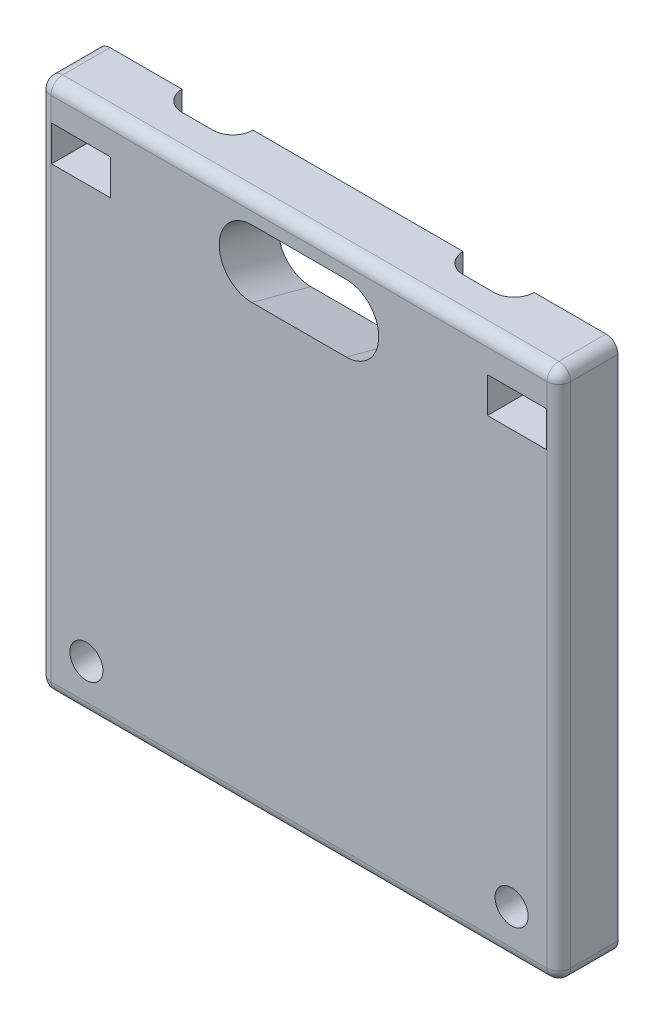
ISO-10303-21;
HEADER;
FILE_DESCRIPTION(('STEP AP214'),'2;1');
FILE_NAME('part.step','',(''),(''),'','','');
FILE_SCHEMA(('AUTOMOTIVE_DESIGN { 1 0 10303 214 1 1 1 1 }'));
ENDSEC;
DATA;
#1=APPLICATION_CONTEXT('core data for automotive mechanical design processes');
#2=APPLICATION_PROTOCOL_DEFINITION('international standard','automotive_design',2000,#1);
#3=PRODUCT_CONTEXT('',#1,'mechanical');
#4=PRODUCT('Part','Part','',(#3));
#5=PRODUCT_RELATED_PRODUCT_CATEGORY('part','',(#4));
#6=PRODUCT_DEFINITION_FORMATION('','',#4);
#7=PRODUCT_DEFINITION_CONTEXT('part definition',#1,'design');
#8=PRODUCT_DEFINITION('design','',#6,#7);
#9=PRODUCT_DEFINITION_SHAPE('','',#8);
#10=(LENGTH_UNIT() NAMED_UNIT(*) SI_UNIT(.MILLI.,.METRE.));
#11=(NAMED_UNIT(*) PLANE_ANGLE_UNIT() SI_UNIT($,.RADIAN.));
#12=(NAMED_UNIT(*) SI_UNIT($,.STERADIAN.) SOLID_ANGLE_UNIT());
#13=UNCERTAINTY_MEASURE_WITH_UNIT(LENGTH_MEASURE(1.E-05),#10,'distance_accuracy_value','');
#14=(GEOMETRIC_REPRESENTATION_CONTEXT(3) GLOBAL_UNCERTAINTY_ASSIGNED_CONTEXT((#13)) GLOBAL_UNIT_ASSIGNED_CONTEXT((#10,
#11,#12)) REPRESENTATION_CONTEXT('',''));
#15=CARTESIAN_POINT('',(0.,0.,0.));
#16=DIRECTION('',(0.,0.,1.));
#17=DIRECTION('',(1.,0.,0.));
#18=AXIS2_PLACEMENT_3D('',#15,#16,#17);
#19=CARTESIAN_POINT('',(0.,0.,0.));
#20=DIRECTION('',(0.,0.,1.));
#21=DIRECTION('',(1.,0.,0.));
#22=AXIS2_PLACEMENT_3D('',#19,#20,#21);
#23=PLANE('',#22);
#24=CARTESIAN_POINT('',(-18.,-18.5,0.));
#25=DIRECTION('',(0.,0.,-1.));
#26=DIRECTION('',(1.,0.,0.));
#27=AXIS2_PLACEMENT_3D('',#24,#25,#26);
#28=CIRCLE('',#27,1.4);
#29=CARTESIAN_POINT('',(-16.6,-18.5,0.));
#30=VERTEX_POINT('',#29);
#31=EDGE_CURVE('E484',#30,#30,#28,.T.);
#32=ORIENTED_EDGE('',*,*,#31,.F.);
#33=EDGE_LOOP('',(#32));
#34=FACE_BOUND('',#33,.T.);
#35=DIRECTION('',(1.,0.,0.));
#36=VECTOR('',#35,1.);
#37=CARTESIAN_POINT('',(-20.95,19.5,0.));
#38=LINE('',#37,#36);
#39=CARTESIAN_POINT('',(-20.95,19.5,0.));
#40=VERTEX_POINT('',#39);
#41=CARTESIAN_POINT('',(-15.95,19.5,0.));
#42=VERTEX_POINT('',#41);
#43=EDGE_CURVE('E300',#40,#42,#38,.T.);
#44=ORIENTED_EDGE('',*,*,#43,.F.);
#45=DIRECTION('',(0.,1.,0.));
#46=VECTOR('',#45,1.);
#47=CARTESIAN_POINT('',(-20.95,19.5,0.));
#48=LINE('',#47,#46);
#49=CARTESIAN_POINT('',(-20.95,16.5,0.));
#50=VERTEX_POINT('',#49);
#51=EDGE_CURVE('E272',#50,#40,#48,.T.);
#52=ORIENTED_EDGE('',*,*,#51,.F.);
#53=DIRECTION('',(-1.,0.,0.));
#54=VECTOR('',#53,1.);
#55=CARTESIAN_POINT('',(-20.95,16.5,0.));
#56=LINE('',#55,#54);
#57=CARTESIAN_POINT('',(-15.95,16.5,0.));
#58=VERTEX_POINT('',#57);
#59=EDGE_CURVE('E293',#58,#50,#56,.T.);
#60=ORIENTED_EDGE('',*,*,#59,.F.);
#61=DIRECTION('',(0.,-1.,0.));
#62=VECTOR('',#61,1.);
#63=CARTESIAN_POINT('',(-15.95,19.5,0.));
#64=LINE('',#63,#62);
#65=EDGE_CURVE('E296',#42,#58,#64,.T.);
#66=ORIENTED_EDGE('',*,*,#65,.F.);
#67=EDGE_LOOP('',(#44,#52,#60,#66));
#68=FACE_BOUND('',#67,.T.);
#69=DIRECTION('',(1.,0.,0.));
#70=VECTOR('',#69,1.);
#71=CARTESIAN_POINT('',(-22.,-22.5,0.));
#72=LINE('',#71,#70);
#73=CARTESIAN_POINT('',(-21.,-22.5,0.));
#74=VERTEX_POINT('',#73);
#75=CARTESIAN_POINT('',(-14.9,-22.5,0.));
#76=VERTEX_POINT('',#75);
#77=EDGE_CURVE('E397',#74,#76,#72,.T.);
#78=ORIENTED_EDGE('',*,*,#77,.F.);
#79=CARTESIAN_POINT('',(-21.,-21.5,0.));
#80=DIRECTION('',(0.,0.,1.));
#81=DIRECTION('',(1.,0.,0.));
#82=AXIS2_PLACEMENT_3D('',#79,#80,#81);
#83=CIRCLE('',#82,1.);
#84=CARTESIAN_POINT('',(-22.,-21.5,0.));
#85=VERTEX_POINT('',#84);
#86=EDGE_CURVE('E11',#74,#85,#83,.F.);
#87=ORIENTED_EDGE('',*,*,#86,.T.);
#88=DIRECTION('',(0.,-1.,0.));
#89=VECTOR('',#88,1.);
#90=CARTESIAN_POINT('',(-22.,22.5,0.));
#91=LINE('',#90,#89);
#92=CARTESIAN_POINT('',(-22.,21.5,0.));
#93=VERTEX_POINT('',#92);
#94=EDGE_CURVE('E392',#93,#85,#91,.T.);
#95=ORIENTED_EDGE('',*,*,#94,.F.);
#96=CARTESIAN_POINT('',(-21.,21.5,0.));
#97=DIRECTION('',(0.,0.,1.));
#98=DIRECTION('',(1.,0.,0.));
#99=AXIS2_PLACEMENT_3D('',#96,#97,#98);
#100=CIRCLE('',#99,1.);
#101=CARTESIAN_POINT('',(-21.,22.5,0.));
#102=VERTEX_POINT('',#101);
#103=EDGE_CURVE('E46',#93,#102,#100,.F.);
#104=ORIENTED_EDGE('',*,*,#103,.T.);
#105=DIRECTION('',(-1.,0.,0.));
#106=VECTOR('',#105,1.);
#107=CARTESIAN_POINT('',(-22.,22.5,0.));
#108=LINE('',#107,#106);
#109=CARTESIAN_POINT('',(-14.9,22.5,0.));
#110=VERTEX_POINT('',#109);
#111=EDGE_CURVE('E389',#110,#102,#108,.T.);
#112=ORIENTED_EDGE('',*,*,#111,.F.);
#113=DIRECTION('',(0.,1.,0.));
#114=VECTOR('',#113,1.);
#115=CARTESIAN_POINT('',(-14.9,-22.5,0.));
#116=LINE('',#115,#114);
#117=EDGE_CURVE('E353',#76,#110,#116,.T.);
#118=ORIENTED_EDGE('',*,*,#117,.F.);
#119=EDGE_LOOP('',(#78,#87,#95,#104,#112,#118));
#120=FACE_BOUND('',#119,.T.);
#121=ADVANCED_FACE('F37',(#34,#68,#120),#23,.F.);
#122=CARTESIAN_POINT('',(18.,-18.5,0.));
#123=DIRECTION('',(0.,0.,-1.));
#124=DIRECTION('',(-1.,0.,0.));
#125=AXIS2_PLACEMENT_3D('',#122,#123,#124);
#126=CIRCLE('',#125,1.4);
#127=CARTESIAN_POINT('',(16.6,-18.5,0.));
#128=VERTEX_POINT('',#127);
#129=EDGE_CURVE('E488',#128,#128,#126,.T.);
#130=ORIENTED_EDGE('',*,*,#129,.F.);
#131=EDGE_LOOP('',(#130));
#132=FACE_BOUND('',#131,.T.);
#133=DIRECTION('',(1.,0.,0.));
#134=VECTOR('',#133,1.);
#135=CARTESIAN_POINT('',(20.95,19.5,0.));
#136=LINE('',#135,#134);
#137=CARTESIAN_POINT('',(15.95,19.5,0.));
#138=VERTEX_POINT('',#137);
#139=CARTESIAN_POINT('',(20.95,19.5,0.));
#140=VERTEX_POINT('',#139);
#141=EDGE_CURVE('E271',#138,#140,#136,.T.);
#142=ORIENTED_EDGE('',*,*,#141,.F.);
#143=DIRECTION('',(0.,1.,0.));
#144=VECTOR('',#143,1.);
#145=CARTESIAN_POINT('',(15.95,19.5,0.));
#146=LINE('',#145,#144);
#147=CARTESIAN_POINT('',(15.95,16.5,0.));
#148=VERTEX_POINT('',#147);
#149=EDGE_CURVE('E241',#148,#138,#146,.T.);
#150=ORIENTED_EDGE('',*,*,#149,.F.);
#151=DIRECTION('',(-1.,0.,0.));
#152=VECTOR('',#151,1.);
#153=CARTESIAN_POINT('',(20.95,16.5,0.));
#154=LINE('',#153,#152);
#155=CARTESIAN_POINT('',(20.95,16.5,0.));
#156=VERTEX_POINT('',#155);
#157=EDGE_CURVE('E259',#156,#148,#154,.T.);
#158=ORIENTED_EDGE('',*,*,#157,.F.);
#159=DIRECTION('',(0.,-1.,0.));
#160=VECTOR('',#159,1.);
#161=CARTESIAN_POINT('',(20.95,19.5,0.));
#162=LINE('',#161,#160);
#163=EDGE_CURVE('E262',#140,#156,#162,.T.);
#164=ORIENTED_EDGE('',*,*,#163,.F.);
#165=EDGE_LOOP('',(#142,#150,#158,#164));
#166=FACE_BOUND('',#165,.T.);
#167=CARTESIAN_POINT('',(21.,22.5,0.));
#168=VERTEX_POINT('',#167);
#169=CARTESIAN_POINT('',(14.9,22.5,0.));
#170=VERTEX_POINT('',#169);
#171=EDGE_CURVE('E390',#168,#170,#108,.T.);
#172=ORIENTED_EDGE('',*,*,#171,.F.);
#173=CARTESIAN_POINT('',(21.,21.5,0.));
#174=DIRECTION('',(0.,0.,1.));
#175=DIRECTION('',(1.,0.,0.));
#176=AXIS2_PLACEMENT_3D('',#173,#174,#175);
#177=CIRCLE('',#176,1.);
#178=CARTESIAN_POINT('',(22.,21.5,0.));
#179=VERTEX_POINT('',#178);
#180=EDGE_CURVE('E446',#168,#179,#177,.F.);
#181=ORIENTED_EDGE('',*,*,#180,.T.);
#182=DIRECTION('',(0.,1.,0.));
#183=VECTOR('',#182,1.);
#184=CARTESIAN_POINT('',(22.,22.5,0.));
#185=LINE('',#184,#183);
#186=CARTESIAN_POINT('',(22.,-21.5,0.));
#187=VERTEX_POINT('',#186);
#188=EDGE_CURVE('E355',#187,#179,#185,.T.);
#189=ORIENTED_EDGE('',*,*,#188,.F.);
#190=CARTESIAN_POINT('',(21.,-21.5,0.));
#191=DIRECTION('',(0.,0.,1.));
#192=DIRECTION('',(1.,0.,0.));
#193=AXIS2_PLACEMENT_3D('',#190,#191,#192);
#194=CIRCLE('',#193,1.);
#195=CARTESIAN_POINT('',(21.,-22.5,0.));
#196=VERTEX_POINT('',#195);
#197=EDGE_CURVE('E444',#187,#196,#194,.F.);
#198=ORIENTED_EDGE('',*,*,#197,.T.);
#199=CARTESIAN_POINT('',(14.9,-22.5,0.));
#200=VERTEX_POINT('',#199);
#201=EDGE_CURVE('E396',#200,#196,#72,.T.);
#202=ORIENTED_EDGE('',*,*,#201,.F.);
#203=DIRECTION('',(0.,1.,0.));
#204=VECTOR('',#203,1.);
#205=CARTESIAN_POINT('',(14.9,-22.5,0.));
#206=LINE('',#205,#204);
#207=EDGE_CURVE('E362',#200,#170,#206,.T.);
#208=ORIENTED_EDGE('',*,*,#207,.T.);
#209=EDGE_LOOP('',(#172,#181,#189,#198,#202,#208));
#210=FACE_BOUND('',#209,.T.);
#211=ADVANCED_FACE('F505',(#132,#166,#210),#23,.F.);
#212=CARTESIAN_POINT('',(22.,22.5,5.));
#213=DIRECTION('',(-1.,0.,0.));
#214=DIRECTION('',(0.,-1.,0.));
#215=AXIS2_PLACEMENT_3D('',#212,#213,#214);
#216=PLANE('',#215);
#217=ORIENTED_EDGE('',*,*,#188,.T.);
#218=DIRECTION('',(0.,0.,-1.));
#219=VECTOR('',#218,1.);
#220=CARTESIAN_POINT('',(22.,21.5,5.));
#221=LINE('',#220,#219);
#222=CARTESIAN_POINT('',(22.,21.5,4.));
#223=VERTEX_POINT('',#222);
#224=EDGE_CURVE('E432',#179,#223,#221,.F.);
#225=ORIENTED_EDGE('',*,*,#224,.T.);
#226=DIRECTION('',(0.,1.,0.));
#227=VECTOR('',#226,1.);
#228=CARTESIAN_POINT('',(22.,-22.5,4.));
#229=LINE('',#228,#227);
#230=CARTESIAN_POINT('',(22.,-21.5,4.));
#231=VERTEX_POINT('',#230);
#232=EDGE_CURVE('E430',#223,#231,#229,.F.);
#233=ORIENTED_EDGE('',*,*,#232,.T.);
#234=DIRECTION('',(0.,0.,-1.));
#235=VECTOR('',#234,1.);
#236=CARTESIAN_POINT('',(22.,-21.5,5.));
#237=LINE('',#236,#235);
#238=EDGE_CURVE('E428',#231,#187,#237,.T.);
#239=ORIENTED_EDGE('',*,*,#238,.T.);
#240=EDGE_LOOP('',(#217,#225,#233,#239));
#241=FACE_BOUND('',#240,.T.);
#242=ADVANCED_FACE('F508',(#241),#216,.F.);
#243=CARTESIAN_POINT('',(-22.,22.5,5.));
#244=DIRECTION('',(0.,-1.,0.));
#245=DIRECTION('',(0.,0.,-1.));
#246=AXIS2_PLACEMENT_3D('',#243,#244,#245);
#247=PLANE('',#246);
#248=DIRECTION('',(-1.,0.,0.));
#249=VECTOR('',#248,1.);
#250=CARTESIAN_POINT('',(22.,22.5,4.));
#251=LINE('',#250,#249);
#252=CARTESIAN_POINT('',(-21.,22.5,4.));
#253=VERTEX_POINT('',#252);
#254=CARTESIAN_POINT('',(21.,22.5,4.));
#255=VERTEX_POINT('',#254);
#256=EDGE_CURVE('E54',#253,#255,#251,.F.);
#257=ORIENTED_EDGE('',*,*,#256,.T.);
#258=DIRECTION('',(0.,0.,-1.));
#259=VECTOR('',#258,1.);
#260=CARTESIAN_POINT('',(21.,22.5,5.));
#261=LINE('',#260,#259);
#262=EDGE_CURVE('E442',#255,#168,#261,.T.);
#263=ORIENTED_EDGE('',*,*,#262,.T.);
#264=ORIENTED_EDGE('',*,*,#171,.T.);
#265=CARTESIAN_POINT('',(13.2,22.5,0.));
#266=DIRECTION('',(0.,1.,0.));
#267=DIRECTION('',(0.,0.,-1.));
#268=AXIS2_PLACEMENT_3D('',#265,#266,#267);
#269=CIRCLE('',#268,1.7);
#270=CARTESIAN_POINT('',(13.2,22.5,1.7));
#271=VERTEX_POINT('',#270);
#272=EDGE_CURVE('E349',#271,#170,#269,.T.);
#273=ORIENTED_EDGE('',*,*,#272,.F.);
#274=DIRECTION('',(1.,0.,0.));
#275=VECTOR('',#274,1.);
#276=CARTESIAN_POINT('',(13.2,22.5,1.7));
#277=LINE('',#276,#275);
#278=CARTESIAN_POINT('',(10.6,22.5,1.7));
#279=VERTEX_POINT('',#278);
#280=EDGE_CURVE('E371',#279,#271,#277,.T.);
#281=ORIENTED_EDGE('',*,*,#280,.F.);
#282=CARTESIAN_POINT('',(10.6,22.5,0.));
#283=DIRECTION('',(0.,1.,0.));
#284=DIRECTION('',(0.,0.,-1.));
#285=AXIS2_PLACEMENT_3D('',#282,#283,#284);
#286=CIRCLE('',#285,1.7);
#287=CARTESIAN_POINT('',(8.9,22.5,0.));
#288=VERTEX_POINT('',#287);
#289=EDGE_CURVE('E374',#288,#279,#286,.T.);
#290=ORIENTED_EDGE('',*,*,#289,.F.);
#291=CARTESIAN_POINT('',(-8.9,22.5,0.));
#292=VERTEX_POINT('',#291);
#293=EDGE_CURVE('E393',#288,#292,#108,.T.);
#294=ORIENTED_EDGE('',*,*,#293,.T.);
#295=CARTESIAN_POINT('',(-10.6,22.5,0.));
#296=DIRECTION('',(0.,1.,0.));
#297=DIRECTION('',(0.,0.,1.));
#298=AXIS2_PLACEMENT_3D('',#295,#296,#297);
#299=CIRCLE('',#298,1.7);
#300=CARTESIAN_POINT('',(-10.6,22.5,1.7));
#301=VERTEX_POINT('',#300);
#302=EDGE_CURVE('E338',#301,#292,#299,.T.);
#303=ORIENTED_EDGE('',*,*,#302,.F.);
#304=DIRECTION('',(1.,0.,0.));
#305=VECTOR('',#304,1.);
#306=CARTESIAN_POINT('',(-13.2,22.5,1.7));
#307=LINE('',#306,#305);
#308=CARTESIAN_POINT('',(-13.2,22.5,1.7));
#309=VERTEX_POINT('',#308);
#310=EDGE_CURVE('E348',#309,#301,#307,.T.);
#311=ORIENTED_EDGE('',*,*,#310,.F.);
#312=CARTESIAN_POINT('',(-13.2,22.5,0.));
#313=DIRECTION('',(0.,1.,0.));
#314=DIRECTION('',(0.,0.,1.));
#315=AXIS2_PLACEMENT_3D('',#312,#313,#314);
#316=CIRCLE('',#315,1.7);
#317=EDGE_CURVE('E345',#110,#309,#316,.T.);
#318=ORIENTED_EDGE('',*,*,#317,.F.);
#319=ORIENTED_EDGE('',*,*,#111,.T.);
#320=DIRECTION('',(0.,0.,-1.));
#321=VECTOR('',#320,1.);
#322=CARTESIAN_POINT('',(-21.,22.5,5.));
#323=LINE('',#322,#321);
#324=EDGE_CURVE('E59',#102,#253,#323,.F.);
#325=ORIENTED_EDGE('',*,*,#324,.T.);
#326=EDGE_LOOP('',(#257,#263,#264,#273,#281,#290,#294,#303,#311,#318,#319,#325));
#327=FACE_BOUND('',#326,.T.);
#328=ADVANCED_FACE('F551',(#327),#247,.F.);
#329=CARTESIAN_POINT('',(-22.,22.5,5.));
#330=DIRECTION('',(1.,0.,0.));
#331=DIRECTION('',(0.,1.,0.));
#332=AXIS2_PLACEMENT_3D('',#329,#330,#331);
#333=PLANE('',#332);
#334=ORIENTED_EDGE('',*,*,#94,.T.);
#335=DIRECTION('',(0.,0.,-1.));
#336=VECTOR('',#335,1.);
#337=CARTESIAN_POINT('',(-22.,-21.5,5.));
#338=LINE('',#337,#336);
#339=CARTESIAN_POINT('',(-22.,-21.5,4.));
#340=VERTEX_POINT('',#339);
#341=EDGE_CURVE('E426',#85,#340,#338,.F.);
#342=ORIENTED_EDGE('',*,*,#341,.T.);
#343=DIRECTION('',(0.,-1.,0.));
#344=VECTOR('',#343,1.);
#345=CARTESIAN_POINT('',(-22.,22.5,4.));
#346=LINE('',#345,#344);
#347=CARTESIAN_POINT('',(-22.,21.5,4.));
#348=VERTEX_POINT('',#347);
#349=EDGE_CURVE('E423',#340,#348,#346,.F.);
#350=ORIENTED_EDGE('',*,*,#349,.T.);
#351=DIRECTION('',(0.,0.,-1.));
#352=VECTOR('',#351,1.);
#353=CARTESIAN_POINT('',(-22.,21.5,5.));
#354=LINE('',#353,#352);
#355=EDGE_CURVE('E421',#348,#93,#354,.T.);
#356=ORIENTED_EDGE('',*,*,#355,.T.);
#357=EDGE_LOOP('',(#334,#342,#350,#356));
#358=FACE_BOUND('',#357,.T.);
#359=ADVANCED_FACE('F577',(#358),#333,.F.);
#360=CARTESIAN_POINT('',(-22.,-22.5,5.));
#361=DIRECTION('',(0.,1.,0.));
#362=DIRECTION('',(0.,0.,1.));
#363=AXIS2_PLACEMENT_3D('',#360,#361,#362);
#364=PLANE('',#363);
#365=ORIENTED_EDGE('',*,*,#201,.T.);
#366=DIRECTION('',(0.,0.,-1.));
#367=VECTOR('',#366,1.);
#368=CARTESIAN_POINT('',(21.,-22.5,5.));
#369=LINE('',#368,#367);
#370=CARTESIAN_POINT('',(21.,-22.5,4.));
#371=VERTEX_POINT('',#370);
#372=EDGE_CURVE('E438',#196,#371,#369,.F.);
#373=ORIENTED_EDGE('',*,*,#372,.T.);
#374=DIRECTION('',(1.,0.,0.));
#375=VECTOR('',#374,1.);
#376=CARTESIAN_POINT('',(-22.,-22.5,4.));
#377=LINE('',#376,#375);
#378=CARTESIAN_POINT('',(-21.,-22.5,4.));
#379=VERTEX_POINT('',#378);
#380=EDGE_CURVE('E436',#371,#379,#377,.F.);
#381=ORIENTED_EDGE('',*,*,#380,.T.);
#382=DIRECTION('',(0.,0.,-1.));
#383=VECTOR('',#382,1.);
#384=CARTESIAN_POINT('',(-21.,-22.5,5.));
#385=LINE('',#384,#383);
#386=EDGE_CURVE('E434',#379,#74,#385,.T.);
#387=ORIENTED_EDGE('',*,*,#386,.T.);
#388=ORIENTED_EDGE('',*,*,#77,.T.);
#389=CARTESIAN_POINT('',(-13.2,-22.5,0.));
#390=DIRECTION('',(0.,1.,0.));
#391=DIRECTION('',(0.,0.,1.));
#392=AXIS2_PLACEMENT_3D('',#389,#390,#391);
#393=CIRCLE('',#392,1.7);
#394=CARTESIAN_POINT('',(-13.2,-22.5,1.7));
#395=VERTEX_POINT('',#394);
#396=EDGE_CURVE('E334',#76,#395,#393,.T.);
#397=ORIENTED_EDGE('',*,*,#396,.T.);
#398=DIRECTION('',(1.,0.,0.));
#399=VECTOR('',#398,1.);
#400=CARTESIAN_POINT('',(-13.2,-22.5,1.7));
#401=LINE('',#400,#399);
#402=CARTESIAN_POINT('',(-10.6,-22.5,1.7));
#403=VERTEX_POINT('',#402);
#404=EDGE_CURVE('E337',#395,#403,#401,.T.);
#405=ORIENTED_EDGE('',*,*,#404,.T.);
#406=CARTESIAN_POINT('',(-10.6,-22.5,0.));
#407=DIRECTION('',(0.,1.,0.));
#408=DIRECTION('',(0.,0.,1.));
#409=AXIS2_PLACEMENT_3D('',#406,#407,#408);
#410=CIRCLE('',#409,1.7);
#411=CARTESIAN_POINT('',(-8.9,-22.5,0.));
#412=VERTEX_POINT('',#411);
#413=EDGE_CURVE('E341',#403,#412,#410,.T.);
#414=ORIENTED_EDGE('',*,*,#413,.T.);
#415=CARTESIAN_POINT('',(8.9,-22.5,0.));
#416=VERTEX_POINT('',#415);
#417=EDGE_CURVE('E400',#412,#416,#72,.T.);
#418=ORIENTED_EDGE('',*,*,#417,.T.);
#419=CARTESIAN_POINT('',(10.6,-22.5,0.));
#420=DIRECTION('',(0.,1.,0.));
#421=DIRECTION('',(0.,0.,-1.));
#422=AXIS2_PLACEMENT_3D('',#419,#420,#421);
#423=CIRCLE('',#422,1.7);
#424=CARTESIAN_POINT('',(10.6,-22.5,1.7));
#425=VERTEX_POINT('',#424);
#426=EDGE_CURVE('E382',#416,#425,#423,.T.);
#427=ORIENTED_EDGE('',*,*,#426,.T.);
#428=DIRECTION('',(1.,0.,0.));
#429=VECTOR('',#428,1.);
#430=CARTESIAN_POINT('',(13.2,-22.5,1.7));
#431=LINE('',#430,#429);
#432=CARTESIAN_POINT('',(13.2,-22.5,1.7));
#433=VERTEX_POINT('',#432);
#434=EDGE_CURVE('E365',#425,#433,#431,.T.);
#435=ORIENTED_EDGE('',*,*,#434,.T.);
#436=CARTESIAN_POINT('',(13.2,-22.5,0.));
#437=DIRECTION('',(0.,1.,0.));
#438=DIRECTION('',(0.,0.,-1.));
#439=AXIS2_PLACEMENT_3D('',#436,#437,#438);
#440=CIRCLE('',#439,1.7);
#441=EDGE_CURVE('E375',#433,#200,#440,.T.);
#442=ORIENTED_EDGE('',*,*,#441,.T.);
#443=EDGE_LOOP('',(#365,#373,#381,#387,#388,#397,#405,#414,#418,#427,#435,#442));
#444=FACE_BOUND('',#443,.T.);
#445=ADVANCED_FACE('F538',(#444),#364,.F.);
#446=CARTESIAN_POINT('',(0.,0.,5.));
#447=DIRECTION('',(0.,0.,1.));
#448=DIRECTION('',(1.,0.,0.));
#449=AXIS2_PLACEMENT_3D('',#446,#447,#448);
#450=PLANE('',#449);
#451=DIRECTION('',(0.,-1.,0.));
#452=VECTOR('',#451,1.);
#453=CARTESIAN_POINT('',(-21.,-22.5,5.));
#454=LINE('',#453,#452);
#455=CARTESIAN_POINT('',(-21.,21.5,5.));
#456=VERTEX_POINT('',#455);
#457=CARTESIAN_POINT('',(-21.,-21.5,5.));
#458=VERTEX_POINT('',#457);
#459=EDGE_CURVE('E416',#456,#458,#454,.T.);
#460=ORIENTED_EDGE('',*,*,#459,.T.);
#461=DIRECTION('',(1.,0.,0.));
#462=VECTOR('',#461,1.);
#463=CARTESIAN_POINT('',(22.,-21.5,5.));
#464=LINE('',#463,#462);
#465=CARTESIAN_POINT('',(21.,-21.5,5.));
#466=VERTEX_POINT('',#465);
#467=EDGE_CURVE('E419',#458,#466,#464,.T.);
#468=ORIENTED_EDGE('',*,*,#467,.T.);
#469=DIRECTION('',(0.,1.,0.));
#470=VECTOR('',#469,1.);
#471=CARTESIAN_POINT('',(21.,22.5,5.));
#472=LINE('',#471,#470);
#473=CARTESIAN_POINT('',(21.,21.5,5.));
#474=VERTEX_POINT('',#473);
#475=EDGE_CURVE('E414',#466,#474,#472,.T.);
#476=ORIENTED_EDGE('',*,*,#475,.T.);
#477=DIRECTION('',(-1.,0.,0.));
#478=VECTOR('',#477,1.);
#479=CARTESIAN_POINT('',(-22.,21.5,5.));
#480=LINE('',#479,#478);
#481=EDGE_CURVE('E412',#474,#456,#480,.T.);
#482=ORIENTED_EDGE('',*,*,#481,.T.);
#483=EDGE_LOOP('',(#460,#468,#476,#482));
#484=FACE_BOUND('',#483,.T.);
#485=CARTESIAN_POINT('',(18.,-18.5,5.));
#486=DIRECTION('',(0.,0.,-1.));
#487=DIRECTION('',(-1.,0.,0.));
#488=AXIS2_PLACEMENT_3D('',#485,#486,#487);
#489=CIRCLE('',#488,1.4);
#490=CARTESIAN_POINT('',(16.6,-18.5,5.));
#491=VERTEX_POINT('',#490);
#492=EDGE_CURVE('E292',#491,#491,#489,.T.);
#493=ORIENTED_EDGE('',*,*,#492,.T.);
#494=EDGE_LOOP('',(#493));
#495=FACE_BOUND('',#494,.T.);
#496=CARTESIAN_POINT('',(-18.,-18.5,5.));
#497=DIRECTION('',(0.,0.,-1.));
#498=DIRECTION('',(1.,0.,0.));
#499=AXIS2_PLACEMENT_3D('',#496,#497,#498);
#500=CIRCLE('',#499,1.4);
#501=CARTESIAN_POINT('',(-16.6,-18.5,5.));
#502=VERTEX_POINT('',#501);
#503=EDGE_CURVE('E265',#502,#502,#500,.T.);
#504=ORIENTED_EDGE('',*,*,#503,.T.);
#505=EDGE_LOOP('',(#504));
#506=FACE_BOUND('',#505,.T.);
#507=DIRECTION('',(0.,1.,0.));
#508=VECTOR('',#507,1.);
#509=CARTESIAN_POINT('',(15.95,19.5,5.));
#510=LINE('',#509,#508);
#511=CARTESIAN_POINT('',(15.95,16.5,5.));
#512=VERTEX_POINT('',#511);
#513=CARTESIAN_POINT('',(15.95,19.5,5.));
#514=VERTEX_POINT('',#513);
#515=EDGE_CURVE('E238',#512,#514,#510,.T.);
#516=ORIENTED_EDGE('',*,*,#515,.T.);
#517=DIRECTION('',(1.,0.,0.));
#518=VECTOR('',#517,1.);
#519=CARTESIAN_POINT('',(20.95,19.5,5.));
#520=LINE('',#519,#518);
#521=CARTESIAN_POINT('',(20.95,19.5,5.));
#522=VERTEX_POINT('',#521);
#523=EDGE_CURVE('E250',#514,#522,#520,.T.);
#524=ORIENTED_EDGE('',*,*,#523,.T.);
#525=DIRECTION('',(0.,-1.,0.));
#526=VECTOR('',#525,1.);
#527=CARTESIAN_POINT('',(20.95,19.5,5.));
#528=LINE('',#527,#526);
#529=CARTESIAN_POINT('',(20.95,16.5,5.));
#530=VERTEX_POINT('',#529);
#531=EDGE_CURVE('E254',#522,#530,#528,.T.);
#532=ORIENTED_EDGE('',*,*,#531,.T.);
#533=DIRECTION('',(-1.,0.,0.));
#534=VECTOR('',#533,1.);
#535=CARTESIAN_POINT('',(20.95,16.5,5.));
#536=LINE('',#535,#534);
#537=EDGE_CURVE('E246',#530,#512,#536,.T.);
#538=ORIENTED_EDGE('',*,*,#537,.T.);
#539=EDGE_LOOP('',(#516,#524,#532,#538));
#540=FACE_BOUND('',#539,.T.);
#541=DIRECTION('',(0.,1.,0.));
#542=VECTOR('',#541,1.);
#543=CARTESIAN_POINT('',(-20.95,19.5,5.));
#544=LINE('',#543,#542);
#545=CARTESIAN_POINT('',(-20.95,16.5,5.));
#546=VERTEX_POINT('',#545);
#547=CARTESIAN_POINT('',(-20.95,19.5,5.));
#548=VERTEX_POINT('',#547);
#549=EDGE_CURVE('E297',#546,#548,#544,.T.);
#550=ORIENTED_EDGE('',*,*,#549,.T.);
#551=DIRECTION('',(1.,0.,0.));
#552=VECTOR('',#551,1.);
#553=CARTESIAN_POINT('',(-20.95,19.5,5.));
#554=LINE('',#553,#552);
#555=CARTESIAN_POINT('',(-15.95,19.5,5.));
#556=VERTEX_POINT('',#555);
#557=EDGE_CURVE('E309',#548,#556,#554,.T.);
#558=ORIENTED_EDGE('',*,*,#557,.T.);
#559=DIRECTION('',(0.,-1.,0.));
#560=VECTOR('',#559,1.);
#561=CARTESIAN_POINT('',(-15.95,19.5,5.));
#562=LINE('',#561,#560);
#563=CARTESIAN_POINT('',(-15.95,16.5,5.));
#564=VERTEX_POINT('',#563);
#565=EDGE_CURVE('E306',#556,#564,#562,.T.);
#566=ORIENTED_EDGE('',*,*,#565,.T.);
#567=DIRECTION('',(-1.,0.,0.));
#568=VECTOR('',#567,1.);
#569=CARTESIAN_POINT('',(-20.95,16.5,5.));
#570=LINE('',#569,#568);
#571=EDGE_CURVE('E285',#564,#546,#570,.T.);
#572=ORIENTED_EDGE('',*,*,#571,.T.);
#573=EDGE_LOOP('',(#550,#558,#566,#572));
#574=FACE_BOUND('',#573,.T.);
#575=CARTESIAN_POINT('',(4.,17.6591471651074,5.));
#576=DIRECTION('',(0.,0.,1.));
#577=DIRECTION('',(0.,-1.,0.));
#578=AXIS2_PLACEMENT_3D('',#575,#576,#577);
#579=ELLIPSE('',#578,2.84700949612773,2.75);
#580=CARTESIAN_POINT('',(4.,14.8121376689797,5.));
#581=VERTEX_POINT('',#580);
#582=CARTESIAN_POINT('',(4.,20.5061566612351,5.));
#583=VERTEX_POINT('',#582);
#584=EDGE_CURVE('E331',#581,#583,#579,.T.);
#585=ORIENTED_EDGE('',*,*,#584,.F.);
#586=DIRECTION('',(1.,0.,0.));
#587=VECTOR('',#586,1.);
#588=CARTESIAN_POINT('',(0.,14.8121376689797,5.));
#589=LINE('',#588,#587);
#590=CARTESIAN_POINT('',(-4.,14.8121376689797,5.));
#591=VERTEX_POINT('',#590);
#592=EDGE_CURVE('E317',#591,#581,#589,.T.);
#593=ORIENTED_EDGE('',*,*,#592,.F.);
#594=CARTESIAN_POINT('',(-4.,17.6591471651074,5.));
#595=DIRECTION('',(0.,0.,1.));
#596=DIRECTION('',(0.,-1.,0.));
#597=AXIS2_PLACEMENT_3D('',#594,#595,#596);
#598=ELLIPSE('',#597,2.84700949612773,2.75);
#599=CARTESIAN_POINT('',(-4.,20.5061566612351,5.));
#600=VERTEX_POINT('',#599);
#601=EDGE_CURVE('E326',#600,#591,#598,.T.);
#602=ORIENTED_EDGE('',*,*,#601,.F.);
#603=DIRECTION('',(-1.,0.,0.));
#604=VECTOR('',#603,1.);
#605=CARTESIAN_POINT('',(0.,20.5061566612351,5.));
#606=LINE('',#605,#604);
#607=EDGE_CURVE('E329',#583,#600,#606,.T.);
#608=ORIENTED_EDGE('',*,*,#607,.F.);
#609=EDGE_LOOP('',(#585,#593,#602,#608));
#610=FACE_BOUND('',#609,.T.);
#611=ADVANCED_FACE('F256',(#484,#495,#506,#540,#574,#610),#450,.T.);
#612=DIRECTION('',(1.,0.,0.));
#613=VECTOR('',#612,1.);
#614=CARTESIAN_POINT('',(0.,13.4723917068241,0.));
#615=LINE('',#614,#613);
#616=CARTESIAN_POINT('',(-4.,13.4723917068241,0.));
#617=VERTEX_POINT('',#616);
#618=CARTESIAN_POINT('',(4.,13.4723917068241,0.));
#619=VERTEX_POINT('',#618);
#620=EDGE_CURVE('E399',#617,#619,#615,.T.);
#621=ORIENTED_EDGE('',*,*,#620,.T.);
#622=CARTESIAN_POINT('',(4.,16.3194012029518,0.));
#623=DIRECTION('',(0.,0.,1.));
#624=DIRECTION('',(0.,-1.,0.));
#625=AXIS2_PLACEMENT_3D('',#622,#623,#624);
#626=ELLIPSE('',#625,2.84700949612773,2.75);
#627=CARTESIAN_POINT('',(4.,19.1664106990795,0.));
#628=VERTEX_POINT('',#627);
#629=EDGE_CURVE('E409',#619,#628,#626,.T.);
#630=ORIENTED_EDGE('',*,*,#629,.T.);
#631=DIRECTION('',(-1.,0.,0.));
#632=VECTOR('',#631,1.);
#633=CARTESIAN_POINT('',(0.,19.1664106990795,0.));
#634=LINE('',#633,#632);
#635=CARTESIAN_POINT('',(-4.,19.1664106990795,0.));
#636=VERTEX_POINT('',#635);
#637=EDGE_CURVE('E406',#628,#636,#634,.T.);
#638=ORIENTED_EDGE('',*,*,#637,.T.);
#639=CARTESIAN_POINT('',(-4.,16.3194012029518,0.));
#640=DIRECTION('',(0.,0.,1.));
#641=DIRECTION('',(0.,-1.,0.));
#642=AXIS2_PLACEMENT_3D('',#639,#640,#641);
#643=ELLIPSE('',#642,2.84700949612773,2.75);
#644=EDGE_CURVE('E403',#636,#617,#643,.T.);
#645=ORIENTED_EDGE('',*,*,#644,.T.);
#646=EDGE_LOOP('',(#621,#630,#638,#645));
#647=FACE_BOUND('',#646,.T.);
#648=ORIENTED_EDGE('',*,*,#417,.F.);
#649=DIRECTION('',(0.,1.,0.));
#650=VECTOR('',#649,1.);
#651=CARTESIAN_POINT('',(-8.9,-22.5,0.));
#652=LINE('',#651,#650);
#653=EDGE_CURVE('E356',#412,#292,#652,.T.);
#654=ORIENTED_EDGE('',*,*,#653,.T.);
#655=ORIENTED_EDGE('',*,*,#293,.F.);
#656=DIRECTION('',(0.,1.,0.));
#657=VECTOR('',#656,1.);
#658=CARTESIAN_POINT('',(8.9,-22.5,0.));
#659=LINE('',#658,#657);
#660=EDGE_CURVE('E366',#416,#288,#659,.T.);
#661=ORIENTED_EDGE('',*,*,#660,.F.);
#662=EDGE_LOOP('',(#648,#654,#655,#661));
#663=FACE_BOUND('',#662,.T.);
#664=ADVANCED_FACE('F510',(#647,#663),#23,.F.);
#665=CARTESIAN_POINT('',(13.2,-22.5,0.));
#666=DIRECTION('',(0.,1.,0.));
#667=DIRECTION('',(0.,0.,1.));
#668=AXIS2_PLACEMENT_3D('',#665,#666,#667);
#669=CYLINDRICAL_SURFACE('',#668,1.7);
#670=ORIENTED_EDGE('',*,*,#272,.T.);
#671=ORIENTED_EDGE('',*,*,#207,.F.);
#672=ORIENTED_EDGE('',*,*,#441,.F.);
#673=DIRECTION('',(0.,1.,0.));
#674=VECTOR('',#673,1.);
#675=CARTESIAN_POINT('',(13.2,-22.5,1.7));
#676=LINE('',#675,#674);
#677=EDGE_CURVE('E333',#433,#271,#676,.T.);
#678=ORIENTED_EDGE('',*,*,#677,.T.);
#679=EDGE_LOOP('',(#670,#671,#672,#678));
#680=FACE_BOUND('',#679,.T.);
#681=ADVANCED_FACE('F557',(#680),#669,.F.);
#682=CARTESIAN_POINT('',(13.2,-22.5,1.7));
#683=DIRECTION('',(0.,0.,1.));
#684=DIRECTION('',(1.,0.,0.));
#685=AXIS2_PLACEMENT_3D('',#682,#683,#684);
#686=PLANE('',#685);
#687=ORIENTED_EDGE('',*,*,#280,.T.);
#688=ORIENTED_EDGE('',*,*,#677,.F.);
#689=ORIENTED_EDGE('',*,*,#434,.F.);
#690=DIRECTION('',(0.,1.,0.));
#691=VECTOR('',#690,1.);
#692=CARTESIAN_POINT('',(10.6,-22.5,1.7));
#693=LINE('',#692,#691);
#694=EDGE_CURVE('E368',#425,#279,#693,.T.);
#695=ORIENTED_EDGE('',*,*,#694,.T.);
#696=EDGE_LOOP('',(#687,#688,#689,#695));
#697=FACE_BOUND('',#696,.T.);
#698=ADVANCED_FACE('F554',(#697),#686,.F.);
#699=CARTESIAN_POINT('',(10.6,-22.5,0.));
#700=DIRECTION('',(0.,1.,0.));
#701=DIRECTION('',(0.,0.,1.));
#702=AXIS2_PLACEMENT_3D('',#699,#700,#701);
#703=CYLINDRICAL_SURFACE('',#702,1.7);
#704=ORIENTED_EDGE('',*,*,#289,.T.);
#705=ORIENTED_EDGE('',*,*,#694,.F.);
#706=ORIENTED_EDGE('',*,*,#426,.F.);
#707=ORIENTED_EDGE('',*,*,#660,.T.);
#708=EDGE_LOOP('',(#704,#705,#706,#707));
#709=FACE_BOUND('',#708,.T.);
#710=ADVANCED_FACE('F549',(#709),#703,.F.);
#711=CARTESIAN_POINT('',(-13.2,-22.5,0.));
#712=DIRECTION('',(0.,1.,0.));
#713=DIRECTION('',(0.,0.,1.));
#714=AXIS2_PLACEMENT_3D('',#711,#712,#713);
#715=CYLINDRICAL_SURFACE('',#714,1.7);
#716=ORIENTED_EDGE('',*,*,#317,.T.);
#717=DIRECTION('',(0.,1.,0.));
#718=VECTOR('',#717,1.);
#719=CARTESIAN_POINT('',(-13.2,-22.5,1.7));
#720=LINE('',#719,#718);
#721=EDGE_CURVE('E344',#395,#309,#720,.T.);
#722=ORIENTED_EDGE('',*,*,#721,.F.);
#723=ORIENTED_EDGE('',*,*,#396,.F.);
#724=ORIENTED_EDGE('',*,*,#117,.T.);
#725=EDGE_LOOP('',(#716,#722,#723,#724));
#726=FACE_BOUND('',#725,.T.);
#727=ADVANCED_FACE('F745',(#726),#715,.F.);
#728=CARTESIAN_POINT('',(-10.6,-22.5,0.));
#729=DIRECTION('',(0.,1.,0.));
#730=DIRECTION('',(0.,0.,1.));
#731=AXIS2_PLACEMENT_3D('',#728,#729,#730);
#732=CYLINDRICAL_SURFACE('',#731,1.7);
#733=ORIENTED_EDGE('',*,*,#302,.T.);
#734=ORIENTED_EDGE('',*,*,#653,.F.);
#735=ORIENTED_EDGE('',*,*,#413,.F.);
#736=DIRECTION('',(0.,1.,0.));
#737=VECTOR('',#736,1.);
#738=CARTESIAN_POINT('',(-10.6,-22.5,1.7));
#739=LINE('',#738,#737);
#740=EDGE_CURVE('E359',#403,#301,#739,.T.);
#741=ORIENTED_EDGE('',*,*,#740,.T.);
#742=EDGE_LOOP('',(#733,#734,#735,#741));
#743=FACE_BOUND('',#742,.T.);
#744=ADVANCED_FACE('F737',(#743),#732,.F.);
#745=CARTESIAN_POINT('',(-13.2,-22.5,1.7));
#746=DIRECTION('',(0.,0.,1.));
#747=DIRECTION('',(1.,0.,0.));
#748=AXIS2_PLACEMENT_3D('',#745,#746,#747);
#749=PLANE('',#748);
#750=ORIENTED_EDGE('',*,*,#310,.T.);
#751=ORIENTED_EDGE('',*,*,#740,.F.);
#752=ORIENTED_EDGE('',*,*,#404,.F.);
#753=ORIENTED_EDGE('',*,*,#721,.T.);
#754=EDGE_LOOP('',(#750,#751,#752,#753));
#755=FACE_BOUND('',#754,.T.);
#756=ADVANCED_FACE('F728',(#755),#749,.F.);
#757=CARTESIAN_POINT('',(4.,17.9834228170543,6.21021320872315));
#758=DIRECTION('',(0.,-0.258819045102521,-0.965925826289068));
#759=DIRECTION('',(0.,0.965925826289068,-0.258819045102521));
#760=AXIS2_PLACEMENT_3D('',#757,#758,#759);
#761=CYLINDRICAL_SURFACE('',#760,2.75);
#762=ORIENTED_EDGE('',*,*,#584,.T.);
#763=DIRECTION('',(0.,-0.258819045102521,-0.965925826289068));
#764=VECTOR('',#763,1.);
#765=CARTESIAN_POINT('',(4.,20.6397188393492,5.49846083469121));
#766=LINE('',#765,#764);
#767=EDGE_CURVE('E314',#583,#628,#766,.T.);
#768=ORIENTED_EDGE('',*,*,#767,.T.);
#769=ORIENTED_EDGE('',*,*,#629,.F.);
#770=DIRECTION('',(0.,-0.258819045102521,-0.965925826289068));
#771=VECTOR('',#770,1.);
#772=CARTESIAN_POINT('',(4.,15.3271267947593,6.92196558275508));
#773=LINE('',#772,#771);
#774=EDGE_CURVE('E278',#581,#619,#773,.T.);
#775=ORIENTED_EDGE('',*,*,#774,.F.);
#776=EDGE_LOOP('',(#762,#768,#769,#775));
#777=FACE_BOUND('',#776,.T.);
#778=ADVANCED_FACE('F720',(#777),#761,.F.);
#779=CARTESIAN_POINT('',(4.,20.6397188393492,5.49846083469121));
#780=DIRECTION('',(0.,0.965925826289068,-0.258819045102521));
#781=DIRECTION('',(0.,0.258819045102521,0.965925826289068));
#782=AXIS2_PLACEMENT_3D('',#779,#780,#781);
#783=PLANE('',#782);
#784=ORIENTED_EDGE('',*,*,#607,.T.);
#785=DIRECTION('',(0.,-0.258819045102521,-0.965925826289068));
#786=VECTOR('',#785,1.);
#787=CARTESIAN_POINT('',(-4.,20.6397188393492,5.49846083469121));
#788=LINE('',#787,#786);
#789=EDGE_CURVE('E318',#600,#636,#788,.T.);
#790=ORIENTED_EDGE('',*,*,#789,.T.);
#791=ORIENTED_EDGE('',*,*,#637,.F.);
#792=ORIENTED_EDGE('',*,*,#767,.F.);
#793=EDGE_LOOP('',(#784,#790,#791,#792));
#794=FACE_BOUND('',#793,.T.);
#795=ADVANCED_FACE('F712',(#794),#783,.F.);
#796=CARTESIAN_POINT('',(-4.,17.9834228170543,6.21021320872315));
#797=DIRECTION('',(0.,-0.258819045102521,-0.965925826289068));
#798=DIRECTION('',(0.,0.965925826289068,-0.258819045102521));
#799=AXIS2_PLACEMENT_3D('',#796,#797,#798);
#800=CYLINDRICAL_SURFACE('',#799,2.75);
#801=ORIENTED_EDGE('',*,*,#601,.T.);
#802=DIRECTION('',(0.,-0.258819045102521,-0.965925826289068));
#803=VECTOR('',#802,1.);
#804=CARTESIAN_POINT('',(-4.,15.3271267947593,6.92196558275508));
#805=LINE('',#804,#803);
#806=EDGE_CURVE('E321',#591,#617,#805,.T.);
#807=ORIENTED_EDGE('',*,*,#806,.T.);
#808=ORIENTED_EDGE('',*,*,#644,.F.);
#809=ORIENTED_EDGE('',*,*,#789,.F.);
#810=EDGE_LOOP('',(#801,#807,#808,#809));
#811=FACE_BOUND('',#810,.T.);
#812=ADVANCED_FACE('F704',(#811),#800,.F.);
#813=CARTESIAN_POINT('',(4.,15.3271267947593,6.92196558275508));
#814=DIRECTION('',(0.,-0.965925826289068,0.258819045102521));
#815=DIRECTION('',(0.,-0.258819045102521,-0.965925826289068));
#816=AXIS2_PLACEMENT_3D('',#813,#814,#815);
#817=PLANE('',#816);
#818=ORIENTED_EDGE('',*,*,#592,.T.);
#819=ORIENTED_EDGE('',*,*,#774,.T.);
#820=ORIENTED_EDGE('',*,*,#620,.F.);
#821=ORIENTED_EDGE('',*,*,#806,.F.);
#822=EDGE_LOOP('',(#818,#819,#820,#821));
#823=FACE_BOUND('',#822,.T.);
#824=ADVANCED_FACE('F696',(#823),#817,.F.);
#825=CARTESIAN_POINT('',(-20.95,19.5,5.));
#826=DIRECTION('',(-1.,0.,0.));
#827=DIRECTION('',(0.,0.,1.));
#828=AXIS2_PLACEMENT_3D('',#825,#826,#827);
#829=PLANE('',#828);
#830=ORIENTED_EDGE('',*,*,#51,.T.);
#831=DIRECTION('',(0.,0.,-1.));
#832=VECTOR('',#831,1.);
#833=CARTESIAN_POINT('',(-20.95,19.5,5.));
#834=LINE('',#833,#832);
#835=EDGE_CURVE('E282',#548,#40,#834,.T.);
#836=ORIENTED_EDGE('',*,*,#835,.F.);
#837=ORIENTED_EDGE('',*,*,#549,.F.);
#838=DIRECTION('',(0.,0.,-1.));
#839=VECTOR('',#838,1.);
#840=CARTESIAN_POINT('',(-20.95,16.5,5.));
#841=LINE('',#840,#839);
#842=EDGE_CURVE('E290',#546,#50,#841,.T.);
#843=ORIENTED_EDGE('',*,*,#842,.T.);
#844=EDGE_LOOP('',(#830,#836,#837,#843));
#845=FACE_BOUND('',#844,.T.);
#846=ADVANCED_FACE('F688',(#845),#829,.F.);
#847=CARTESIAN_POINT('',(-20.95,16.5,5.));
#848=DIRECTION('',(0.,-1.,0.));
#849=DIRECTION('',(0.,0.,-1.));
#850=AXIS2_PLACEMENT_3D('',#847,#848,#849);
#851=PLANE('',#850);
#852=ORIENTED_EDGE('',*,*,#59,.T.);
#853=ORIENTED_EDGE('',*,*,#842,.F.);
#854=ORIENTED_EDGE('',*,*,#571,.F.);
#855=DIRECTION('',(0.,0.,-1.));
#856=VECTOR('',#855,1.);
#857=CARTESIAN_POINT('',(-15.95,16.5,5.));
#858=LINE('',#857,#856);
#859=EDGE_CURVE('E288',#564,#58,#858,.T.);
#860=ORIENTED_EDGE('',*,*,#859,.T.);
#861=EDGE_LOOP('',(#852,#853,#854,#860));
#862=FACE_BOUND('',#861,.T.);
#863=ADVANCED_FACE('F680',(#862),#851,.F.);
#864=CARTESIAN_POINT('',(-15.95,19.5,5.));
#865=DIRECTION('',(1.,0.,0.));
#866=DIRECTION('',(0.,0.,-1.));
#867=AXIS2_PLACEMENT_3D('',#864,#865,#866);
#868=PLANE('',#867);
#869=ORIENTED_EDGE('',*,*,#65,.T.);
#870=ORIENTED_EDGE('',*,*,#859,.F.);
#871=ORIENTED_EDGE('',*,*,#565,.F.);
#872=DIRECTION('',(0.,0.,-1.));
#873=VECTOR('',#872,1.);
#874=CARTESIAN_POINT('',(-15.95,19.5,5.));
#875=LINE('',#874,#873);
#876=EDGE_CURVE('E286',#556,#42,#875,.T.);
#877=ORIENTED_EDGE('',*,*,#876,.T.);
#878=EDGE_LOOP('',(#869,#870,#871,#877));
#879=FACE_BOUND('',#878,.T.);
#880=ADVANCED_FACE('F672',(#879),#868,.F.);
#881=CARTESIAN_POINT('',(-20.95,19.5,5.));
#882=DIRECTION('',(0.,1.,0.));
#883=DIRECTION('',(0.,0.,1.));
#884=AXIS2_PLACEMENT_3D('',#881,#882,#883);
#885=PLANE('',#884);
#886=ORIENTED_EDGE('',*,*,#43,.T.);
#887=ORIENTED_EDGE('',*,*,#876,.F.);
#888=ORIENTED_EDGE('',*,*,#557,.F.);
#889=ORIENTED_EDGE('',*,*,#835,.T.);
#890=EDGE_LOOP('',(#886,#887,#888,#889));
#891=FACE_BOUND('',#890,.T.);
#892=ADVANCED_FACE('F665',(#891),#885,.F.);
#893=CARTESIAN_POINT('',(15.95,19.5,5.));
#894=DIRECTION('',(-1.,0.,0.));
#895=DIRECTION('',(0.,0.,1.));
#896=AXIS2_PLACEMENT_3D('',#893,#894,#895);
#897=PLANE('',#896);
#898=ORIENTED_EDGE('',*,*,#149,.T.);
#899=DIRECTION('',(0.,0.,-1.));
#900=VECTOR('',#899,1.);
#901=CARTESIAN_POINT('',(15.95,19.5,5.));
#902=LINE('',#901,#900);
#903=EDGE_CURVE('E234',#514,#138,#902,.T.);
#904=ORIENTED_EDGE('',*,*,#903,.F.);
#905=ORIENTED_EDGE('',*,*,#515,.F.);
#906=DIRECTION('',(0.,0.,-1.));
#907=VECTOR('',#906,1.);
#908=CARTESIAN_POINT('',(15.95,16.5,5.));
#909=LINE('',#908,#907);
#910=EDGE_CURVE('E276',#512,#148,#909,.T.);
#911=ORIENTED_EDGE('',*,*,#910,.T.);
#912=EDGE_LOOP('',(#898,#904,#905,#911));
#913=FACE_BOUND('',#912,.T.);
#914=ADVANCED_FACE('F236',(#913),#897,.F.);
#915=CARTESIAN_POINT('',(20.95,16.5,5.));
#916=DIRECTION('',(0.,-1.,0.));
#917=DIRECTION('',(0.,0.,-1.));
#918=AXIS2_PLACEMENT_3D('',#915,#916,#917);
#919=PLANE('',#918);
#920=ORIENTED_EDGE('',*,*,#157,.T.);
#921=ORIENTED_EDGE('',*,*,#910,.F.);
#922=ORIENTED_EDGE('',*,*,#537,.F.);
#923=DIRECTION('',(0.,0.,-1.));
#924=VECTOR('',#923,1.);
#925=CARTESIAN_POINT('',(20.95,16.5,5.));
#926=LINE('',#925,#924);
#927=EDGE_CURVE('E279',#530,#156,#926,.T.);
#928=ORIENTED_EDGE('',*,*,#927,.T.);
#929=EDGE_LOOP('',(#920,#921,#922,#928));
#930=FACE_BOUND('',#929,.T.);
#931=ADVANCED_FACE('F650',(#930),#919,.F.);
#932=CARTESIAN_POINT('',(20.95,19.5,5.));
#933=DIRECTION('',(1.,0.,0.));
#934=DIRECTION('',(0.,0.,-1.));
#935=AXIS2_PLACEMENT_3D('',#932,#933,#934);
#936=PLANE('',#935);
#937=ORIENTED_EDGE('',*,*,#163,.T.);
#938=ORIENTED_EDGE('',*,*,#927,.F.);
#939=ORIENTED_EDGE('',*,*,#531,.F.);
#940=DIRECTION('',(0.,0.,-1.));
#941=VECTOR('',#940,1.);
#942=CARTESIAN_POINT('',(20.95,19.5,5.));
#943=LINE('',#942,#941);
#944=EDGE_CURVE('E245',#522,#140,#943,.T.);
#945=ORIENTED_EDGE('',*,*,#944,.T.);
#946=EDGE_LOOP('',(#937,#938,#939,#945));
#947=FACE_BOUND('',#946,.T.);
#948=ADVANCED_FACE('F643',(#947),#936,.F.);
#949=CARTESIAN_POINT('',(20.95,19.5,5.));
#950=DIRECTION('',(0.,1.,0.));
#951=DIRECTION('',(0.,0.,1.));
#952=AXIS2_PLACEMENT_3D('',#949,#950,#951);
#953=PLANE('',#952);
#954=ORIENTED_EDGE('',*,*,#141,.T.);
#955=ORIENTED_EDGE('',*,*,#944,.F.);
#956=ORIENTED_EDGE('',*,*,#523,.F.);
#957=ORIENTED_EDGE('',*,*,#903,.T.);
#958=EDGE_LOOP('',(#954,#955,#956,#957));
#959=FACE_BOUND('',#958,.T.);
#960=ADVANCED_FACE('F251',(#959),#953,.F.);
#961=CARTESIAN_POINT('',(-18.,-18.5,5.));
#962=DIRECTION('',(0.,0.,-1.));
#963=DIRECTION('',(-1.,0.,0.));
#964=AXIS2_PLACEMENT_3D('',#961,#962,#963);
#965=CYLINDRICAL_SURFACE('',#964,1.4);
#966=ORIENTED_EDGE('',*,*,#503,.F.);
#967=EDGE_LOOP('',(#966));
#968=FACE_BOUND('',#967,.T.);
#969=ORIENTED_EDGE('',*,*,#31,.T.);
#970=EDGE_LOOP('',(#969));
#971=FACE_BOUND('',#970,.T.);
#972=ADVANCED_FACE('F501',(#968,#971),#965,.F.);
#973=CARTESIAN_POINT('',(18.,-18.5,5.));
#974=DIRECTION('',(0.,0.,-1.));
#975=DIRECTION('',(-1.,0.,0.));
#976=AXIS2_PLACEMENT_3D('',#973,#974,#975);
#977=CYLINDRICAL_SURFACE('',#976,1.4);
#978=ORIENTED_EDGE('',*,*,#492,.F.);
#979=EDGE_LOOP('',(#978));
#980=FACE_BOUND('',#979,.T.);
#981=ORIENTED_EDGE('',*,*,#129,.T.);
#982=EDGE_LOOP('',(#981));
#983=FACE_BOUND('',#982,.T.);
#984=ADVANCED_FACE('F498',(#980,#983),#977,.F.);
#985=CARTESIAN_POINT('',(21.,21.5,5.));
#986=DIRECTION('',(0.,0.,-1.));
#987=DIRECTION('',(-1.,0.,0.));
#988=AXIS2_PLACEMENT_3D('',#985,#986,#987);
#989=CYLINDRICAL_SURFACE('',#988,1.);
#990=ORIENTED_EDGE('',*,*,#180,.F.);
#991=ORIENTED_EDGE('',*,*,#262,.F.);
#992=CARTESIAN_POINT('',(21.,21.5,4.));
#993=DIRECTION('',(0.,0.,1.));
#994=DIRECTION('',(1.,0.,0.));
#995=AXIS2_PLACEMENT_3D('',#992,#993,#994);
#996=CIRCLE('',#995,1.);
#997=EDGE_CURVE('E41',#223,#255,#996,.T.);
#998=ORIENTED_EDGE('',*,*,#997,.F.);
#999=ORIENTED_EDGE('',*,*,#224,.F.);
#1000=EDGE_LOOP('',(#990,#991,#998,#999));
#1001=FACE_BOUND('',#1000,.T.);
#1002=ADVANCED_FACE('F39',(#1001),#989,.T.);
#1003=CARTESIAN_POINT('',(21.,0.,4.));
#1004=DIRECTION('',(0.,-1.,0.));
#1005=DIRECTION('',(1.,0.,0.));
#1006=AXIS2_PLACEMENT_3D('',#1003,#1004,#1005);
#1007=CYLINDRICAL_SURFACE('',#1006,1.);
#1008=CARTESIAN_POINT('',(21.,-21.5,4.));
#1009=DIRECTION('',(0.,-1.,0.));
#1010=DIRECTION('',(0.,0.,-1.));
#1011=AXIS2_PLACEMENT_3D('',#1008,#1009,#1010);
#1012=CIRCLE('',#1011,1.);
#1013=EDGE_CURVE('E474',#231,#466,#1012,.T.);
#1014=ORIENTED_EDGE('',*,*,#1013,.F.);
#1015=ORIENTED_EDGE('',*,*,#232,.F.);
#1016=CARTESIAN_POINT('',(21.,21.5,4.));
#1017=DIRECTION('',(0.,1.,0.));
#1018=DIRECTION('',(0.,0.,1.));
#1019=AXIS2_PLACEMENT_3D('',#1016,#1017,#1018);
#1020=CIRCLE('',#1019,1.);
#1021=EDGE_CURVE('E476',#474,#223,#1020,.T.);
#1022=ORIENTED_EDGE('',*,*,#1021,.F.);
#1023=ORIENTED_EDGE('',*,*,#475,.F.);
#1024=EDGE_LOOP('',(#1014,#1015,#1022,#1023));
#1025=FACE_BOUND('',#1024,.T.);
#1026=ADVANCED_FACE('F525',(#1025),#1007,.T.);
#1027=CARTESIAN_POINT('',(21.,-21.5,5.));
#1028=DIRECTION('',(0.,0.,-1.));
#1029=DIRECTION('',(-1.,0.,0.));
#1030=AXIS2_PLACEMENT_3D('',#1027,#1028,#1029);
#1031=CYLINDRICAL_SURFACE('',#1030,1.);
#1032=ORIENTED_EDGE('',*,*,#197,.F.);
#1033=ORIENTED_EDGE('',*,*,#238,.F.);
#1034=CARTESIAN_POINT('',(21.,-21.5,4.));
#1035=DIRECTION('',(0.,0.,1.));
#1036=DIRECTION('',(1.,0.,0.));
#1037=AXIS2_PLACEMENT_3D('',#1034,#1035,#1036);
#1038=CIRCLE('',#1037,1.);
#1039=EDGE_CURVE('E471',#371,#231,#1038,.T.);
#1040=ORIENTED_EDGE('',*,*,#1039,.F.);
#1041=ORIENTED_EDGE('',*,*,#372,.F.);
#1042=EDGE_LOOP('',(#1032,#1033,#1040,#1041));
#1043=FACE_BOUND('',#1042,.T.);
#1044=ADVANCED_FACE('F535',(#1043),#1031,.T.);
#1045=CARTESIAN_POINT('',(21.,21.5,4.));
#1046=DIRECTION('',(1.,0.,0.));
#1047=DIRECTION('',(0.,0.,-1.));
#1048=AXIS2_PLACEMENT_3D('',#1045,#1046,#1047);
#1049=SPHERICAL_SURFACE('',#1048,1.);
#1050=ORIENTED_EDGE('',*,*,#1021,.T.);
#1051=ORIENTED_EDGE('',*,*,#997,.T.);
#1052=CARTESIAN_POINT('',(21.,21.5,4.));
#1053=DIRECTION('',(1.,0.,0.));
#1054=DIRECTION('',(0.,0.,-1.));
#1055=AXIS2_PLACEMENT_3D('',#1052,#1053,#1054);
#1056=CIRCLE('',#1055,1.);
#1057=EDGE_CURVE('E468',#474,#255,#1056,.F.);
#1058=ORIENTED_EDGE('',*,*,#1057,.F.);
#1059=EDGE_LOOP('',(#1050,#1051,#1058));
#1060=FACE_BOUND('',#1059,.T.);
#1061=ADVANCED_FACE('F615',(#1060),#1049,.T.);
#1062=CARTESIAN_POINT('',(21.,-21.5,4.));
#1063=DIRECTION('',(1.,0.,0.));
#1064=DIRECTION('',(0.,0.,-1.));
#1065=AXIS2_PLACEMENT_3D('',#1062,#1063,#1064);
#1066=SPHERICAL_SURFACE('',#1065,1.);
#1067=ORIENTED_EDGE('',*,*,#1039,.T.);
#1068=ORIENTED_EDGE('',*,*,#1013,.T.);
#1069=CARTESIAN_POINT('',(21.,-21.5,4.));
#1070=DIRECTION('',(1.,0.,0.));
#1071=DIRECTION('',(0.,0.,-1.));
#1072=AXIS2_PLACEMENT_3D('',#1069,#1070,#1071);
#1073=CIRCLE('',#1072,1.);
#1074=EDGE_CURVE('E465',#371,#466,#1073,.F.);
#1075=ORIENTED_EDGE('',*,*,#1074,.F.);
#1076=EDGE_LOOP('',(#1067,#1068,#1075));
#1077=FACE_BOUND('',#1076,.T.);
#1078=ADVANCED_FACE('F530',(#1077),#1066,.T.);
#1079=CARTESIAN_POINT('',(-21.,21.5,5.));
#1080=DIRECTION('',(0.,0.,-1.));
#1081=DIRECTION('',(-1.,0.,0.));
#1082=AXIS2_PLACEMENT_3D('',#1079,#1080,#1081);
#1083=CYLINDRICAL_SURFACE('',#1082,1.);
#1084=ORIENTED_EDGE('',*,*,#103,.F.);
#1085=ORIENTED_EDGE('',*,*,#355,.F.);
#1086=CARTESIAN_POINT('',(-21.,21.5,4.));
#1087=DIRECTION('',(0.,0.,1.));
#1088=DIRECTION('',(1.,0.,0.));
#1089=AXIS2_PLACEMENT_3D('',#1086,#1087,#1088);
#1090=CIRCLE('',#1089,1.);
#1091=EDGE_CURVE('E462',#253,#348,#1090,.T.);
#1092=ORIENTED_EDGE('',*,*,#1091,.F.);
#1093=ORIENTED_EDGE('',*,*,#324,.F.);
#1094=EDGE_LOOP('',(#1084,#1085,#1092,#1093));
#1095=FACE_BOUND('',#1094,.T.);
#1096=ADVANCED_FACE('F608',(#1095),#1083,.T.);
#1097=CARTESIAN_POINT('',(0.,21.5,4.));
#1098=DIRECTION('',(1.,0.,0.));
#1099=DIRECTION('',(0.,0.,-1.));
#1100=AXIS2_PLACEMENT_3D('',#1097,#1098,#1099);
#1101=CYLINDRICAL_SURFACE('',#1100,1.);
#1102=ORIENTED_EDGE('',*,*,#1057,.T.);
#1103=ORIENTED_EDGE('',*,*,#256,.F.);
#1104=CARTESIAN_POINT('',(-21.,21.5,4.));
#1105=DIRECTION('',(-1.,0.,0.));
#1106=DIRECTION('',(0.,0.,1.));
#1107=AXIS2_PLACEMENT_3D('',#1104,#1105,#1106);
#1108=CIRCLE('',#1107,1.);
#1109=EDGE_CURVE('E459',#456,#253,#1108,.T.);
#1110=ORIENTED_EDGE('',*,*,#1109,.F.);
#1111=ORIENTED_EDGE('',*,*,#481,.F.);
#1112=EDGE_LOOP('',(#1102,#1103,#1110,#1111));
#1113=FACE_BOUND('',#1112,.T.);
#1114=ADVANCED_FACE('F604',(#1113),#1101,.T.);
#1115=CARTESIAN_POINT('',(0.,-21.5,4.));
#1116=DIRECTION('',(-1.,0.,0.));
#1117=DIRECTION('',(0.,0.,1.));
#1118=AXIS2_PLACEMENT_3D('',#1115,#1116,#1117);
#1119=CYLINDRICAL_SURFACE('',#1118,1.);
#1120=ORIENTED_EDGE('',*,*,#1074,.T.);
#1121=ORIENTED_EDGE('',*,*,#467,.F.);
#1122=CARTESIAN_POINT('',(-21.,-21.5,4.));
#1123=DIRECTION('',(-1.,0.,0.));
#1124=DIRECTION('',(0.,0.,1.));
#1125=AXIS2_PLACEMENT_3D('',#1122,#1123,#1124);
#1126=CIRCLE('',#1125,1.);
#1127=EDGE_CURVE('E456',#379,#458,#1126,.T.);
#1128=ORIENTED_EDGE('',*,*,#1127,.F.);
#1129=ORIENTED_EDGE('',*,*,#380,.F.);
#1130=EDGE_LOOP('',(#1120,#1121,#1128,#1129));
#1131=FACE_BOUND('',#1130,.T.);
#1132=ADVANCED_FACE('F600',(#1131),#1119,.T.);
#1133=CARTESIAN_POINT('',(-21.,-21.5,5.));
#1134=DIRECTION('',(0.,0.,-1.));
#1135=DIRECTION('',(-1.,0.,0.));
#1136=AXIS2_PLACEMENT_3D('',#1133,#1134,#1135);
#1137=CYLINDRICAL_SURFACE('',#1136,1.);
#1138=ORIENTED_EDGE('',*,*,#86,.F.);
#1139=ORIENTED_EDGE('',*,*,#386,.F.);
#1140=CARTESIAN_POINT('',(-21.,-21.5,4.));
#1141=DIRECTION('',(0.,0.,1.));
#1142=DIRECTION('',(1.,0.,0.));
#1143=AXIS2_PLACEMENT_3D('',#1140,#1141,#1142);
#1144=CIRCLE('',#1143,1.);
#1145=EDGE_CURVE('E453',#340,#379,#1144,.T.);
#1146=ORIENTED_EDGE('',*,*,#1145,.F.);
#1147=ORIENTED_EDGE('',*,*,#341,.F.);
#1148=EDGE_LOOP('',(#1138,#1139,#1146,#1147));
#1149=FACE_BOUND('',#1148,.T.);
#1150=ADVANCED_FACE('F596',(#1149),#1137,.T.);
#1151=CARTESIAN_POINT('',(-21.,21.5,4.));
#1152=DIRECTION('',(0.,1.,0.));
#1153=DIRECTION('',(0.,0.,1.));
#1154=AXIS2_PLACEMENT_3D('',#1151,#1152,#1153);
#1155=SPHERICAL_SURFACE('',#1154,1.);
#1156=ORIENTED_EDGE('',*,*,#1109,.T.);
#1157=ORIENTED_EDGE('',*,*,#1091,.T.);
#1158=CARTESIAN_POINT('',(-21.,21.5,4.));
#1159=DIRECTION('',(0.,1.,0.));
#1160=DIRECTION('',(0.,0.,1.));
#1161=AXIS2_PLACEMENT_3D('',#1158,#1159,#1160);
#1162=CIRCLE('',#1161,1.);
#1163=EDGE_CURVE('E451',#456,#348,#1162,.F.);
#1164=ORIENTED_EDGE('',*,*,#1163,.F.);
#1165=EDGE_LOOP('',(#1156,#1157,#1164));
#1166=FACE_BOUND('',#1165,.T.);
#1167=ADVANCED_FACE('F592',(#1166),#1155,.T.);
#1168=CARTESIAN_POINT('',(-21.,-21.5,4.));
#1169=DIRECTION('',(0.,-1.,0.));
#1170=DIRECTION('',(0.,0.,-1.));
#1171=AXIS2_PLACEMENT_3D('',#1168,#1169,#1170);
#1172=SPHERICAL_SURFACE('',#1171,1.);
#1173=ORIENTED_EDGE('',*,*,#1145,.T.);
#1174=ORIENTED_EDGE('',*,*,#1127,.T.);
#1175=CARTESIAN_POINT('',(-21.,-21.5,4.));
#1176=DIRECTION('',(0.,-1.,0.));
#1177=DIRECTION('',(0.,0.,-1.));
#1178=AXIS2_PLACEMENT_3D('',#1175,#1176,#1177);
#1179=CIRCLE('',#1178,1.);
#1180=EDGE_CURVE('E449',#340,#458,#1179,.F.);
#1181=ORIENTED_EDGE('',*,*,#1180,.F.);
#1182=EDGE_LOOP('',(#1173,#1174,#1181));
#1183=FACE_BOUND('',#1182,.T.);
#1184=ADVANCED_FACE('F588',(#1183),#1172,.T.);
#1185=CARTESIAN_POINT('',(-21.,0.,4.));
#1186=DIRECTION('',(0.,1.,0.));
#1187=DIRECTION('',(-1.,0.,0.));
#1188=AXIS2_PLACEMENT_3D('',#1185,#1186,#1187);
#1189=CYLINDRICAL_SURFACE('',#1188,1.);
#1190=ORIENTED_EDGE('',*,*,#1163,.T.);
#1191=ORIENTED_EDGE('',*,*,#349,.F.);
#1192=ORIENTED_EDGE('',*,*,#1180,.T.);
#1193=ORIENTED_EDGE('',*,*,#459,.F.);
#1194=EDGE_LOOP('',(#1190,#1191,#1192,#1193));
#1195=FACE_BOUND('',#1194,.T.);
#1196=ADVANCED_FACE('F585',(#1195),#1189,.T.);
#1197=CLOSED_SHELL('',(#121,#211,#242,#328,#359,#445,#611,#664,#681,#698,#710,#727,#744,#756,
#778,#795,#812,#824,#846,#863,#880,#892,#914,#931,#948,#960,#972,#984,#1002,#1026,#1044,#1061,
#1078,#1096,#1114,#1132,#1150,#1167,#1184,#1196));
#1198=MANIFOLD_SOLID_BREP('B2',#1197);
#1199=ADVANCED_BREP_SHAPE_REPRESENTATION('',(#18,#1198),#14);
#1200=SHAPE_DEFINITION_REPRESENTATION(#9,#1199);
ENDSEC;
END-ISO-10303-21;
